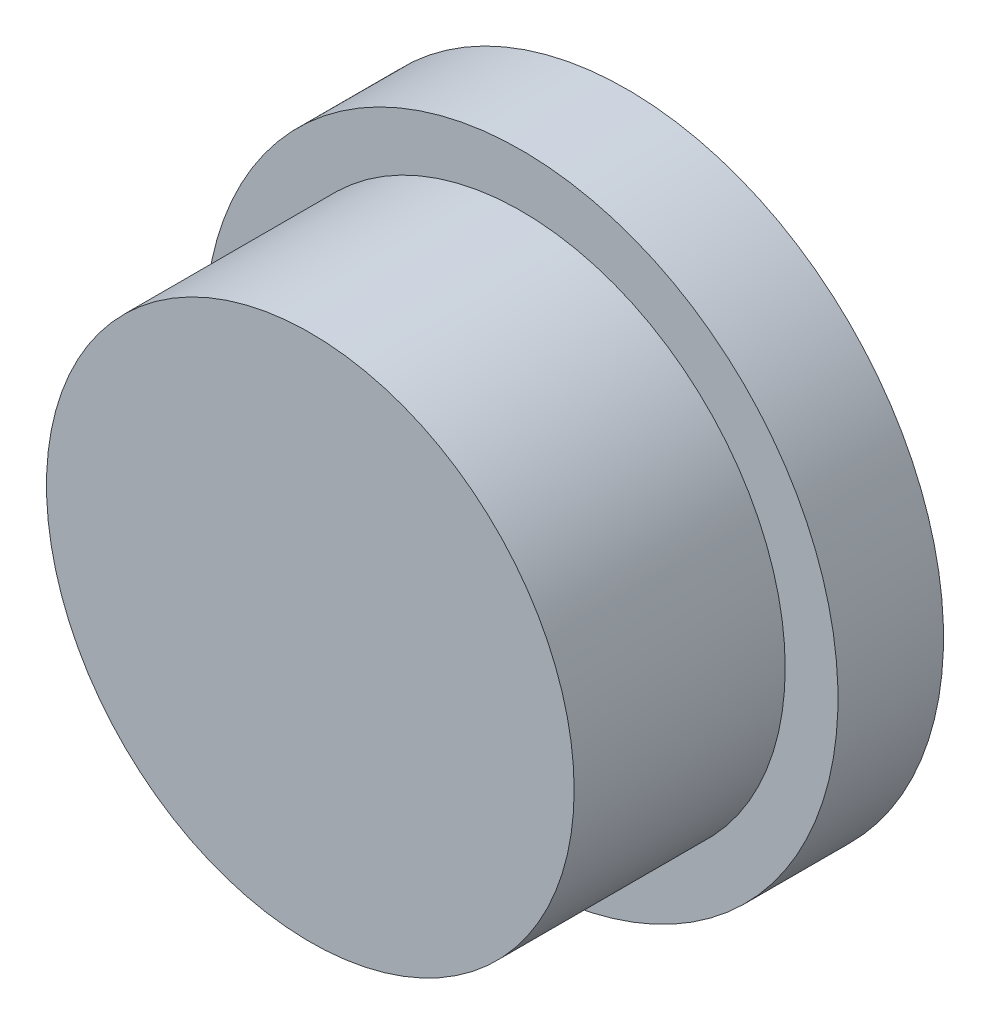
ISO-10303-21;
HEADER;
FILE_DESCRIPTION(('STEP AP214'),'2;1');
FILE_NAME('part.step','',(''),(''),'','','');
FILE_SCHEMA(('AUTOMOTIVE_DESIGN { 1 0 10303 214 1 1 1 1 }'));
ENDSEC;
DATA;
#1=APPLICATION_CONTEXT('core data for automotive mechanical design processes');
#2=APPLICATION_PROTOCOL_DEFINITION('international standard','automotive_design',2000,#1);
#3=PRODUCT_CONTEXT('',#1,'mechanical');
#4=PRODUCT('Part','Part','',(#3));
#5=PRODUCT_RELATED_PRODUCT_CATEGORY('part','',(#4));
#6=PRODUCT_DEFINITION_FORMATION('','',#4);
#7=PRODUCT_DEFINITION_CONTEXT('part definition',#1,'design');
#8=PRODUCT_DEFINITION('design','',#6,#7);
#9=PRODUCT_DEFINITION_SHAPE('','',#8);
#10=(LENGTH_UNIT() NAMED_UNIT(*) SI_UNIT(.MILLI.,.METRE.));
#11=(NAMED_UNIT(*) PLANE_ANGLE_UNIT() SI_UNIT($,.RADIAN.));
#12=(NAMED_UNIT(*) SI_UNIT($,.STERADIAN.) SOLID_ANGLE_UNIT());
#13=UNCERTAINTY_MEASURE_WITH_UNIT(LENGTH_MEASURE(1.E-05),#10,'distance_accuracy_value','');
#14=(GEOMETRIC_REPRESENTATION_CONTEXT(3) GLOBAL_UNCERTAINTY_ASSIGNED_CONTEXT((#13)) GLOBAL_UNIT_ASSIGNED_CONTEXT((#10,
#11,#12)) REPRESENTATION_CONTEXT('',''));
#15=CARTESIAN_POINT('',(0.,0.,0.));
#16=DIRECTION('',(0.,0.,1.));
#17=DIRECTION('',(1.,0.,0.));
#18=AXIS2_PLACEMENT_3D('',#15,#16,#17);
#19=CARTESIAN_POINT('',(0.,0.,2.));
#20=DIRECTION('',(0.,0.,-1.));
#21=DIRECTION('',(-1.,0.,0.));
#22=AXIS2_PLACEMENT_3D('',#19,#20,#21);
#23=CYLINDRICAL_SURFACE('',#22,2.5);
#24=CARTESIAN_POINT('',(0.,0.,2.));
#25=DIRECTION('',(0.,0.,1.));
#26=DIRECTION('',(1.,0.,0.));
#27=AXIS2_PLACEMENT_3D('',#24,#25,#26);
#28=CIRCLE('',#27,2.5);
#29=CARTESIAN_POINT('',(2.5,0.,2.));
#30=VERTEX_POINT('',#29);
#31=EDGE_CURVE('E10',#30,#30,#28,.T.);
#32=ORIENTED_EDGE('',*,*,#31,.F.);
#33=EDGE_LOOP('',(#32));
#34=FACE_BOUND('',#33,.T.);
#35=CARTESIAN_POINT('',(0.,0.,0.));
#36=DIRECTION('',(0.,0.,1.));
#37=DIRECTION('',(1.,0.,0.));
#38=AXIS2_PLACEMENT_3D('',#35,#36,#37);
#39=CIRCLE('',#38,2.5);
#40=CARTESIAN_POINT('',(2.5,0.,0.));
#41=VERTEX_POINT('',#40);
#42=EDGE_CURVE('E36',#41,#41,#39,.T.);
#43=ORIENTED_EDGE('',*,*,#42,.T.);
#44=EDGE_LOOP('',(#43));
#45=FACE_BOUND('',#44,.T.);
#46=ADVANCED_FACE('F33',(#34,#45),#23,.T.);
#47=CARTESIAN_POINT('',(0.,0.,2.));
#48=DIRECTION('',(0.,0.,1.));
#49=DIRECTION('',(1.,0.,0.));
#50=AXIS2_PLACEMENT_3D('',#47,#48,#49);
#51=PLANE('',#50);
#52=ORIENTED_EDGE('',*,*,#31,.T.);
#53=EDGE_LOOP('',(#52));
#54=FACE_BOUND('',#53,.T.);
#55=ADVANCED_FACE('F56',(#54),#51,.T.);
#56=CARTESIAN_POINT('',(0.,0.,-1.));
#57=DIRECTION('',(0.,0.,1.));
#58=DIRECTION('',(1.,0.,0.));
#59=AXIS2_PLACEMENT_3D('',#56,#57,#58);
#60=CYLINDRICAL_SURFACE('',#59,3.);
#61=CARTESIAN_POINT('',(0.,0.,-1.));
#62=DIRECTION('',(0.,0.,-1.));
#63=DIRECTION('',(-1.,0.,0.));
#64=AXIS2_PLACEMENT_3D('',#61,#62,#63);
#65=CIRCLE('',#64,3.);
#66=CARTESIAN_POINT('',(-3.,0.,-1.));
#67=VERTEX_POINT('',#66);
#68=EDGE_CURVE('E43',#67,#67,#65,.T.);
#69=ORIENTED_EDGE('',*,*,#68,.F.);
#70=EDGE_LOOP('',(#69));
#71=FACE_BOUND('',#70,.T.);
#72=CARTESIAN_POINT('',(0.,0.,0.));
#73=DIRECTION('',(0.,0.,-1.));
#74=DIRECTION('',(-1.,0.,0.));
#75=AXIS2_PLACEMENT_3D('',#72,#73,#74);
#76=CIRCLE('',#75,3.);
#77=CARTESIAN_POINT('',(-3.,0.,0.));
#78=VERTEX_POINT('',#77);
#79=EDGE_CURVE('E45',#78,#78,#76,.T.);
#80=ORIENTED_EDGE('',*,*,#79,.T.);
#81=EDGE_LOOP('',(#80));
#82=FACE_BOUND('',#81,.T.);
#83=ADVANCED_FACE('F53',(#71,#82),#60,.T.);
#84=CARTESIAN_POINT('',(0.,0.,-1.));
#85=DIRECTION('',(0.,0.,-1.));
#86=DIRECTION('',(-1.,0.,0.));
#87=AXIS2_PLACEMENT_3D('',#84,#85,#86);
#88=PLANE('',#87);
#89=ORIENTED_EDGE('',*,*,#68,.T.);
#90=EDGE_LOOP('',(#89));
#91=FACE_BOUND('',#90,.T.);
#92=ADVANCED_FACE('F51',(#91),#88,.T.);
#93=CARTESIAN_POINT('',(0.,0.,0.));
#94=DIRECTION('',(0.,0.,-1.));
#95=DIRECTION('',(-1.,0.,0.));
#96=AXIS2_PLACEMENT_3D('',#93,#94,#95);
#97=PLANE('',#96);
#98=ORIENTED_EDGE('',*,*,#42,.F.);
#99=EDGE_LOOP('',(#98));
#100=FACE_BOUND('',#99,.T.);
#101=ORIENTED_EDGE('',*,*,#79,.F.);
#102=EDGE_LOOP('',(#101));
#103=FACE_BOUND('',#102,.T.);
#104=ADVANCED_FACE('F60',(#100,#103),#97,.F.);
#105=CLOSED_SHELL('',(#46,#55,#83,#92,#104));
#106=MANIFOLD_SOLID_BREP('B2',#105);
#107=ADVANCED_BREP_SHAPE_REPRESENTATION('',(#18,#106),#14);
#108=SHAPE_DEFINITION_REPRESENTATION(#9,#107);
ENDSEC;
END-ISO-10303-21;
